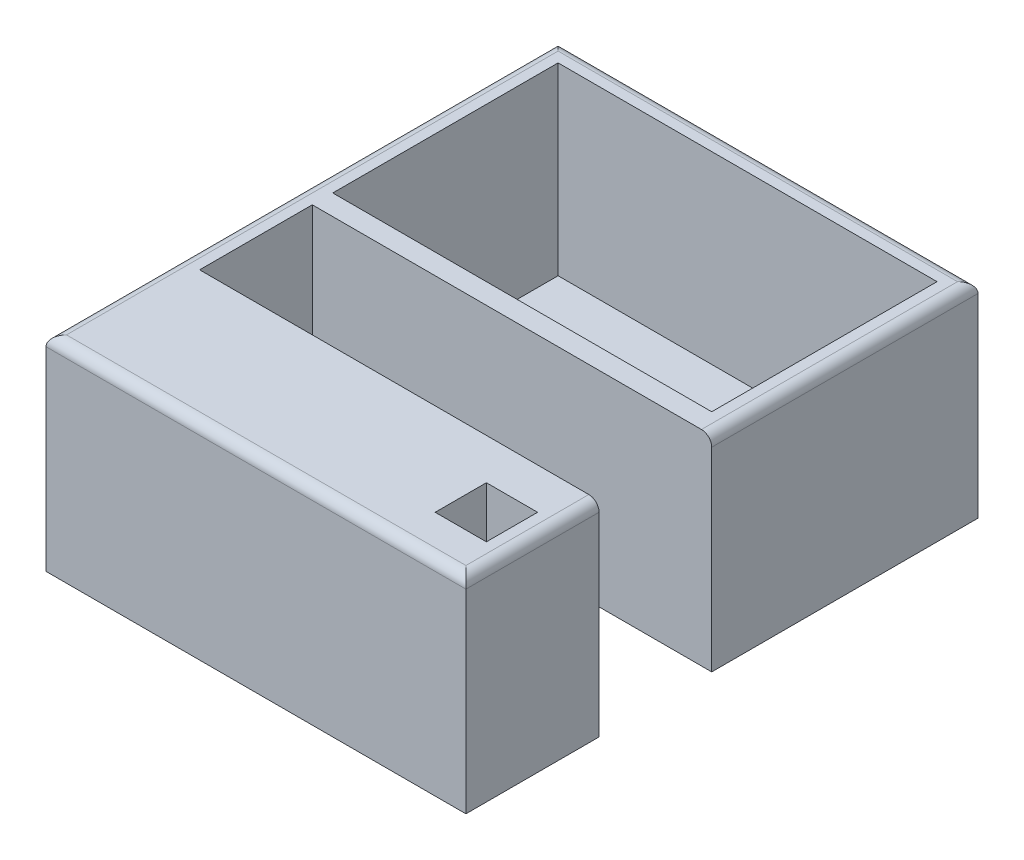
ISO-10303-21;
HEADER;
FILE_DESCRIPTION(('STEP AP214'),'2;1');
FILE_NAME('part.step','',(''),(''),'','','');
FILE_SCHEMA(('AUTOMOTIVE_DESIGN { 1 0 10303 214 1 1 1 1 }'));
ENDSEC;
DATA;
#1=APPLICATION_CONTEXT('core data for automotive mechanical design processes');
#2=APPLICATION_PROTOCOL_DEFINITION('international standard','automotive_design',2000,#1);
#3=PRODUCT_CONTEXT('',#1,'mechanical');
#4=PRODUCT('Part','Part','',(#3));
#5=PRODUCT_RELATED_PRODUCT_CATEGORY('part','',(#4));
#6=PRODUCT_DEFINITION_FORMATION('','',#4);
#7=PRODUCT_DEFINITION_CONTEXT('part definition',#1,'design');
#8=PRODUCT_DEFINITION('design','',#6,#7);
#9=PRODUCT_DEFINITION_SHAPE('','',#8);
#10=(LENGTH_UNIT() NAMED_UNIT(*) SI_UNIT(.MILLI.,.METRE.));
#11=(NAMED_UNIT(*) PLANE_ANGLE_UNIT() SI_UNIT($,.RADIAN.));
#12=(NAMED_UNIT(*) SI_UNIT($,.STERADIAN.) SOLID_ANGLE_UNIT());
#13=UNCERTAINTY_MEASURE_WITH_UNIT(LENGTH_MEASURE(1.E-05),#10,'distance_accuracy_value','');
#14=(GEOMETRIC_REPRESENTATION_CONTEXT(3) GLOBAL_UNCERTAINTY_ASSIGNED_CONTEXT((#13)) GLOBAL_UNIT_ASSIGNED_CONTEXT((#10,
#11,#12)) REPRESENTATION_CONTEXT('',''));
#15=CARTESIAN_POINT('',(0.,0.,0.));
#16=DIRECTION('',(0.,0.,1.));
#17=DIRECTION('',(1.,0.,0.));
#18=AXIS2_PLACEMENT_3D('',#15,#16,#17);
#19=CARTESIAN_POINT('',(0.,2.,0.));
#20=DIRECTION('',(0.,1.,0.));
#21=DIRECTION('',(0.,0.,1.));
#22=AXIS2_PLACEMENT_3D('',#19,#20,#21);
#23=PLANE('',#22);
#24=DIRECTION('',(-1.,0.,0.));
#25=VECTOR('',#24,1.);
#26=CARTESIAN_POINT('',(0.,2.,12.));
#27=LINE('',#26,#25);
#28=CARTESIAN_POINT('',(-17.5,2.,12.));
#29=VERTEX_POINT('',#28);
#30=CARTESIAN_POINT('',(-18.5,2.,12.));
#31=VERTEX_POINT('',#30);
#32=EDGE_CURVE('E319',#29,#31,#27,.T.);
#33=ORIENTED_EDGE('',*,*,#32,.F.);
#34=DIRECTION('',(0.,0.,-1.));
#35=VECTOR('',#34,1.);
#36=CARTESIAN_POINT('',(-17.5,2.,12.));
#37=LINE('',#36,#35);
#38=CARTESIAN_POINT('',(-17.5,2.,1.));
#39=VERTEX_POINT('',#38);
#40=EDGE_CURVE('E298',#29,#39,#37,.T.);
#41=ORIENTED_EDGE('',*,*,#40,.T.);
#42=DIRECTION('',(-1.,0.,0.));
#43=VECTOR('',#42,1.);
#44=CARTESIAN_POINT('',(0.,2.,1.));
#45=LINE('',#44,#43);
#46=CARTESIAN_POINT('',(-18.5,2.,1.));
#47=VERTEX_POINT('',#46);
#48=EDGE_CURVE('E312',#39,#47,#45,.T.);
#49=ORIENTED_EDGE('',*,*,#48,.T.);
#50=DIRECTION('',(0.,0.,1.));
#51=VECTOR('',#50,1.);
#52=CARTESIAN_POINT('',(-18.5,2.,0.));
#53=LINE('',#52,#51);
#54=EDGE_CURVE('E196',#47,#31,#53,.T.);
#55=ORIENTED_EDGE('',*,*,#54,.T.);
#56=EDGE_LOOP('',(#33,#41,#49,#55));
#57=FACE_BOUND('',#56,.T.);
#58=ADVANCED_FACE('F33',(#57),#23,.T.);
#59=CARTESIAN_POINT('',(20.5,2.,12.));
#60=DIRECTION('',(-1.,0.,0.));
#61=DIRECTION('',(0.,0.,1.));
#62=AXIS2_PLACEMENT_3D('',#59,#60,#61);
#63=PLANE('',#62);
#64=DIRECTION('',(0.,-1.,0.));
#65=VECTOR('',#64,1.);
#66=CARTESIAN_POINT('',(20.5,2.,12.));
#67=LINE('',#66,#65);
#68=CARTESIAN_POINT('',(20.5,19.,12.));
#69=VERTEX_POINT('',#68);
#70=CARTESIAN_POINT('',(20.5,0.,12.));
#71=VERTEX_POINT('',#70);
#72=EDGE_CURVE('E310',#69,#71,#67,.T.);
#73=ORIENTED_EDGE('',*,*,#72,.F.);
#74=DIRECTION('',(0.,0.,-1.));
#75=VECTOR('',#74,1.);
#76=CARTESIAN_POINT('',(20.5,19.,25.));
#77=LINE('',#76,#75);
#78=CARTESIAN_POINT('',(20.5,19.,25.));
#79=VERTEX_POINT('',#78);
#80=EDGE_CURVE('E11',#69,#79,#77,.F.);
#81=ORIENTED_EDGE('',*,*,#80,.T.);
#82=DIRECTION('',(0.,-1.,0.));
#83=VECTOR('',#82,1.);
#84=CARTESIAN_POINT('',(20.5,2.,25.));
#85=LINE('',#84,#83);
#86=CARTESIAN_POINT('',(20.5,0.,25.));
#87=VERTEX_POINT('',#86);
#88=EDGE_CURVE('E299',#79,#87,#85,.T.);
#89=ORIENTED_EDGE('',*,*,#88,.T.);
#90=DIRECTION('',(0.,0.,-1.));
#91=VECTOR('',#90,1.);
#92=CARTESIAN_POINT('',(20.5,0.,12.));
#93=LINE('',#92,#91);
#94=EDGE_CURVE('E265',#87,#71,#93,.T.);
#95=ORIENTED_EDGE('',*,*,#94,.T.);
#96=EDGE_LOOP('',(#73,#81,#89,#95));
#97=FACE_BOUND('',#96,.T.);
#98=ADVANCED_FACE('F397',(#97),#63,.F.);
#99=CARTESIAN_POINT('',(20.5,2.,12.));
#100=DIRECTION('',(0.,0.,1.));
#101=DIRECTION('',(1.,0.,0.));
#102=AXIS2_PLACEMENT_3D('',#99,#100,#101);
#103=PLANE('',#102);
#104=DIRECTION('',(-1.,0.,0.));
#105=VECTOR('',#104,1.);
#106=CARTESIAN_POINT('',(0.,20.,12.));
#107=LINE('',#106,#105);
#108=CARTESIAN_POINT('',(19.5,20.,12.));
#109=VERTEX_POINT('',#108);
#110=CARTESIAN_POINT('',(-18.5,20.,12.));
#111=VERTEX_POINT('',#110);
#112=EDGE_CURVE('E188',#109,#111,#107,.T.);
#113=ORIENTED_EDGE('',*,*,#112,.F.);
#114=CARTESIAN_POINT('',(19.5,19.,12.));
#115=DIRECTION('',(0.,0.,1.));
#116=DIRECTION('',(1.,0.,0.));
#117=AXIS2_PLACEMENT_3D('',#114,#115,#116);
#118=CIRCLE('',#117,1.);
#119=EDGE_CURVE('E42',#109,#69,#118,.F.);
#120=ORIENTED_EDGE('',*,*,#119,.T.);
#121=ORIENTED_EDGE('',*,*,#72,.T.);
#122=DIRECTION('',(-1.,0.,0.));
#123=VECTOR('',#122,1.);
#124=CARTESIAN_POINT('',(20.5,0.,12.));
#125=LINE('',#124,#123);
#126=CARTESIAN_POINT('',(-17.5,0.,12.));
#127=VERTEX_POINT('',#126);
#128=EDGE_CURVE('E279',#71,#127,#125,.T.);
#129=ORIENTED_EDGE('',*,*,#128,.T.);
#130=DIRECTION('',(0.,-1.,0.));
#131=VECTOR('',#130,1.);
#132=CARTESIAN_POINT('',(-17.5,2.,12.));
#133=LINE('',#132,#131);
#134=EDGE_CURVE('E313',#29,#127,#133,.T.);
#135=ORIENTED_EDGE('',*,*,#134,.F.);
#136=ORIENTED_EDGE('',*,*,#32,.T.);
#137=DIRECTION('',(0.,-1.,0.));
#138=VECTOR('',#137,1.);
#139=CARTESIAN_POINT('',(-18.5,20.,12.));
#140=LINE('',#139,#138);
#141=EDGE_CURVE('E198',#111,#31,#140,.T.);
#142=ORIENTED_EDGE('',*,*,#141,.F.);
#143=EDGE_LOOP('',(#113,#120,#121,#129,#135,#136,#142));
#144=FACE_BOUND('',#143,.T.);
#145=ADVANCED_FACE('F403',(#144),#103,.F.);
#146=CARTESIAN_POINT('',(-17.5,2.,12.));
#147=DIRECTION('',(-1.,0.,0.));
#148=DIRECTION('',(0.,0.,1.));
#149=AXIS2_PLACEMENT_3D('',#146,#147,#148);
#150=PLANE('',#149);
#151=DIRECTION('',(0.,0.,-1.));
#152=VECTOR('',#151,1.);
#153=CARTESIAN_POINT('',(-17.5,0.,12.));
#154=LINE('',#153,#152);
#155=CARTESIAN_POINT('',(-17.5,0.,1.));
#156=VERTEX_POINT('',#155);
#157=EDGE_CURVE('E281',#127,#156,#154,.T.);
#158=ORIENTED_EDGE('',*,*,#157,.T.);
#159=DIRECTION('',(0.,-1.,0.));
#160=VECTOR('',#159,1.);
#161=CARTESIAN_POINT('',(-17.5,2.,1.));
#162=LINE('',#161,#160);
#163=EDGE_CURVE('E309',#39,#156,#162,.T.);
#164=ORIENTED_EDGE('',*,*,#163,.F.);
#165=ORIENTED_EDGE('',*,*,#40,.F.);
#166=ORIENTED_EDGE('',*,*,#134,.T.);
#167=EDGE_LOOP('',(#158,#164,#165,#166));
#168=FACE_BOUND('',#167,.T.);
#169=ADVANCED_FACE('F510',(#168),#150,.F.);
#170=CARTESIAN_POINT('',(20.5,2.,0.999999999999999));
#171=DIRECTION('',(0.,0.,-1.));
#172=DIRECTION('',(-1.,0.,0.));
#173=AXIS2_PLACEMENT_3D('',#170,#171,#172);
#174=PLANE('',#173);
#175=DIRECTION('',(0.,-1.,0.));
#176=VECTOR('',#175,1.);
#177=CARTESIAN_POINT('',(20.5,2.,0.999999999999999));
#178=LINE('',#177,#176);
#179=CARTESIAN_POINT('',(20.5,19.,0.999999999999999));
#180=VERTEX_POINT('',#179);
#181=CARTESIAN_POINT('',(20.5,0.,0.999999999999999));
#182=VERTEX_POINT('',#181);
#183=EDGE_CURVE('E307',#180,#182,#178,.T.);
#184=ORIENTED_EDGE('',*,*,#183,.F.);
#185=CARTESIAN_POINT('',(19.5,19.,0.999999999999999));
#186=DIRECTION('',(0.,0.,-1.));
#187=DIRECTION('',(-1.,0.,0.));
#188=AXIS2_PLACEMENT_3D('',#185,#186,#187);
#189=CIRCLE('',#188,1.);
#190=CARTESIAN_POINT('',(19.5,20.,1.));
#191=VERTEX_POINT('',#190);
#192=EDGE_CURVE('E183',#180,#191,#189,.F.);
#193=ORIENTED_EDGE('',*,*,#192,.T.);
#194=DIRECTION('',(-1.,0.,0.));
#195=VECTOR('',#194,1.);
#196=CARTESIAN_POINT('',(0.,20.,1.));
#197=LINE('',#196,#195);
#198=CARTESIAN_POINT('',(-18.5,20.,1.));
#199=VERTEX_POINT('',#198);
#200=EDGE_CURVE('E176',#191,#199,#197,.T.);
#201=ORIENTED_EDGE('',*,*,#200,.T.);
#202=DIRECTION('',(0.,-1.,0.));
#203=VECTOR('',#202,1.);
#204=CARTESIAN_POINT('',(-18.5,20.,1.));
#205=LINE('',#204,#203);
#206=EDGE_CURVE('E180',#199,#47,#205,.T.);
#207=ORIENTED_EDGE('',*,*,#206,.T.);
#208=ORIENTED_EDGE('',*,*,#48,.F.);
#209=ORIENTED_EDGE('',*,*,#163,.T.);
#210=DIRECTION('',(1.,0.,0.));
#211=VECTOR('',#210,1.);
#212=CARTESIAN_POINT('',(20.5,0.,0.999999999999999));
#213=LINE('',#212,#211);
#214=EDGE_CURVE('E283',#156,#182,#213,.T.);
#215=ORIENTED_EDGE('',*,*,#214,.T.);
#216=EDGE_LOOP('',(#184,#193,#201,#207,#208,#209,#215));
#217=FACE_BOUND('',#216,.T.);
#218=ADVANCED_FACE('F179',(#217),#174,.F.);
#219=CARTESIAN_POINT('',(20.5,2.,-25.));
#220=DIRECTION('',(-1.,0.,0.));
#221=DIRECTION('',(0.,0.,1.));
#222=AXIS2_PLACEMENT_3D('',#219,#220,#221);
#223=PLANE('',#222);
#224=DIRECTION('',(0.,-1.,0.));
#225=VECTOR('',#224,1.);
#226=CARTESIAN_POINT('',(20.5,2.,-25.));
#227=LINE('',#226,#225);
#228=CARTESIAN_POINT('',(20.5,19.,-25.));
#229=VERTEX_POINT('',#228);
#230=CARTESIAN_POINT('',(20.5,0.,-25.));
#231=VERTEX_POINT('',#230);
#232=EDGE_CURVE('E305',#229,#231,#227,.T.);
#233=ORIENTED_EDGE('',*,*,#232,.F.);
#234=DIRECTION('',(0.,0.,-1.));
#235=VECTOR('',#234,1.);
#236=CARTESIAN_POINT('',(20.5,19.,0.999999999999997));
#237=LINE('',#236,#235);
#238=EDGE_CURVE('E338',#229,#180,#237,.F.);
#239=ORIENTED_EDGE('',*,*,#238,.T.);
#240=ORIENTED_EDGE('',*,*,#183,.T.);
#241=DIRECTION('',(0.,0.,-1.));
#242=VECTOR('',#241,1.);
#243=CARTESIAN_POINT('',(20.5,0.,-25.));
#244=LINE('',#243,#242);
#245=EDGE_CURVE('E286',#182,#231,#244,.T.);
#246=ORIENTED_EDGE('',*,*,#245,.T.);
#247=EDGE_LOOP('',(#233,#239,#240,#246));
#248=FACE_BOUND('',#247,.T.);
#249=ADVANCED_FACE('F518',(#248),#223,.F.);
#250=CARTESIAN_POINT('',(-20.5,2.,-25.));
#251=DIRECTION('',(0.,0.,1.));
#252=DIRECTION('',(1.,0.,0.));
#253=AXIS2_PLACEMENT_3D('',#250,#251,#252);
#254=PLANE('',#253);
#255=DIRECTION('',(0.,-1.,0.));
#256=VECTOR('',#255,1.);
#257=CARTESIAN_POINT('',(-20.5,2.,-25.));
#258=LINE('',#257,#256);
#259=CARTESIAN_POINT('',(-20.5,19.,-25.));
#260=VERTEX_POINT('',#259);
#261=CARTESIAN_POINT('',(-20.5,0.,-25.));
#262=VERTEX_POINT('',#261);
#263=EDGE_CURVE('E303',#260,#262,#258,.T.);
#264=ORIENTED_EDGE('',*,*,#263,.F.);
#265=DIRECTION('',(-1.,0.,0.));
#266=VECTOR('',#265,1.);
#267=CARTESIAN_POINT('',(20.5,19.,-25.));
#268=LINE('',#267,#266);
#269=EDGE_CURVE('E341',#260,#229,#268,.F.);
#270=ORIENTED_EDGE('',*,*,#269,.T.);
#271=ORIENTED_EDGE('',*,*,#232,.T.);
#272=DIRECTION('',(-1.,0.,0.));
#273=VECTOR('',#272,1.);
#274=CARTESIAN_POINT('',(-20.5,0.,-25.));
#275=LINE('',#274,#273);
#276=EDGE_CURVE('E289',#231,#262,#275,.T.);
#277=ORIENTED_EDGE('',*,*,#276,.T.);
#278=EDGE_LOOP('',(#264,#270,#271,#277));
#279=FACE_BOUND('',#278,.T.);
#280=ADVANCED_FACE('F525',(#279),#254,.F.);
#281=CARTESIAN_POINT('',(-20.5,2.,-25.));
#282=DIRECTION('',(1.,0.,0.));
#283=DIRECTION('',(0.,0.,-1.));
#284=AXIS2_PLACEMENT_3D('',#281,#282,#283);
#285=PLANE('',#284);
#286=DIRECTION('',(0.,-1.,0.));
#287=VECTOR('',#286,1.);
#288=CARTESIAN_POINT('',(-20.5,2.,25.));
#289=LINE('',#288,#287);
#290=CARTESIAN_POINT('',(-20.5,19.,25.));
#291=VERTEX_POINT('',#290);
#292=CARTESIAN_POINT('',(-20.5,0.,25.));
#293=VERTEX_POINT('',#292);
#294=EDGE_CURVE('E301',#291,#293,#289,.T.);
#295=ORIENTED_EDGE('',*,*,#294,.F.);
#296=DIRECTION('',(0.,0.,1.));
#297=VECTOR('',#296,1.);
#298=CARTESIAN_POINT('',(-20.5,19.,-25.));
#299=LINE('',#298,#297);
#300=EDGE_CURVE('E343',#291,#260,#299,.F.);
#301=ORIENTED_EDGE('',*,*,#300,.T.);
#302=ORIENTED_EDGE('',*,*,#263,.T.);
#303=DIRECTION('',(0.,0.,1.));
#304=VECTOR('',#303,1.);
#305=CARTESIAN_POINT('',(-20.5,0.,-25.));
#306=LINE('',#305,#304);
#307=EDGE_CURVE('E292',#262,#293,#306,.T.);
#308=ORIENTED_EDGE('',*,*,#307,.T.);
#309=EDGE_LOOP('',(#295,#301,#302,#308));
#310=FACE_BOUND('',#309,.T.);
#311=ADVANCED_FACE('F533',(#310),#285,.F.);
#312=CARTESIAN_POINT('',(-20.5,2.,25.));
#313=DIRECTION('',(0.,0.,-1.));
#314=DIRECTION('',(-1.,0.,0.));
#315=AXIS2_PLACEMENT_3D('',#312,#313,#314);
#316=PLANE('',#315);
#317=ORIENTED_EDGE('',*,*,#88,.F.);
#318=DIRECTION('',(1.,0.,0.));
#319=VECTOR('',#318,1.);
#320=CARTESIAN_POINT('',(-20.5,19.,25.));
#321=LINE('',#320,#319);
#322=EDGE_CURVE('E345',#79,#291,#321,.F.);
#323=ORIENTED_EDGE('',*,*,#322,.T.);
#324=ORIENTED_EDGE('',*,*,#294,.T.);
#325=DIRECTION('',(1.,0.,0.));
#326=VECTOR('',#325,1.);
#327=CARTESIAN_POINT('',(-20.5,0.,25.));
#328=LINE('',#327,#326);
#329=EDGE_CURVE('E295',#293,#87,#328,.T.);
#330=ORIENTED_EDGE('',*,*,#329,.T.);
#331=EDGE_LOOP('',(#317,#323,#324,#330));
#332=FACE_BOUND('',#331,.T.);
#333=ADVANCED_FACE('F540',(#332),#316,.F.);
#334=CARTESIAN_POINT('',(0.,0.,0.));
#335=DIRECTION('',(0.,1.,0.));
#336=DIRECTION('',(0.,0.,1.));
#337=AXIS2_PLACEMENT_3D('',#334,#335,#336);
#338=PLANE('',#337);
#339=CARTESIAN_POINT('',(16.,0.,18.5));
#340=DIRECTION('',(0.,1.,0.));
#341=DIRECTION('',(0.,0.,1.));
#342=AXIS2_PLACEMENT_3D('',#339,#340,#341);
#343=CIRCLE('',#342,1.25);
#344=CARTESIAN_POINT('',(16.,0.,19.75));
#345=VERTEX_POINT('',#344);
#346=EDGE_CURVE('E365',#345,#345,#343,.T.);
#347=ORIENTED_EDGE('',*,*,#346,.T.);
#348=EDGE_LOOP('',(#347));
#349=FACE_BOUND('',#348,.T.);
#350=CARTESIAN_POINT('',(16.,0.,-20.5));
#351=DIRECTION('',(0.,1.,0.));
#352=DIRECTION('',(0.,0.,1.));
#353=AXIS2_PLACEMENT_3D('',#350,#351,#352);
#354=CIRCLE('',#353,1.25);
#355=CARTESIAN_POINT('',(16.,0.,-19.25));
#356=VERTEX_POINT('',#355);
#357=EDGE_CURVE('E208',#356,#356,#354,.T.);
#358=ORIENTED_EDGE('',*,*,#357,.T.);
#359=EDGE_LOOP('',(#358));
#360=FACE_BOUND('',#359,.T.);
#361=ORIENTED_EDGE('',*,*,#94,.F.);
#362=ORIENTED_EDGE('',*,*,#329,.F.);
#363=ORIENTED_EDGE('',*,*,#307,.F.);
#364=ORIENTED_EDGE('',*,*,#276,.F.);
#365=ORIENTED_EDGE('',*,*,#245,.F.);
#366=ORIENTED_EDGE('',*,*,#214,.F.);
#367=ORIENTED_EDGE('',*,*,#157,.F.);
#368=ORIENTED_EDGE('',*,*,#128,.F.);
#369=EDGE_LOOP('',(#361,#362,#363,#364,#365,#366,#367,#368));
#370=FACE_BOUND('',#369,.T.);
#371=ADVANCED_FACE('F378',(#349,#360,#370),#338,.F.);
#372=CARTESIAN_POINT('',(0.,20.,16.));
#373=DIRECTION('',(0.,0.,-1.));
#374=DIRECTION('',(-1.,0.,0.));
#375=AXIS2_PLACEMENT_3D('',#372,#373,#374);
#376=PLANE('',#375);
#377=DIRECTION('',(1.,0.,0.));
#378=VECTOR('',#377,1.);
#379=CARTESIAN_POINT('',(0.,2.,16.));
#380=LINE('',#379,#378);
#381=CARTESIAN_POINT('',(13.5,2.,16.));
#382=VERTEX_POINT('',#381);
#383=CARTESIAN_POINT('',(18.5,2.,16.));
#384=VERTEX_POINT('',#383);
#385=EDGE_CURVE('E245',#382,#384,#380,.T.);
#386=ORIENTED_EDGE('',*,*,#385,.T.);
#387=DIRECTION('',(0.,-1.,0.));
#388=VECTOR('',#387,1.);
#389=CARTESIAN_POINT('',(18.5,20.,16.));
#390=LINE('',#389,#388);
#391=CARTESIAN_POINT('',(18.5,20.,16.));
#392=VERTEX_POINT('',#391);
#393=EDGE_CURVE('E262',#392,#384,#390,.T.);
#394=ORIENTED_EDGE('',*,*,#393,.F.);
#395=DIRECTION('',(1.,0.,0.));
#396=VECTOR('',#395,1.);
#397=CARTESIAN_POINT('',(0.,20.,16.));
#398=LINE('',#397,#396);
#399=CARTESIAN_POINT('',(13.5,20.,16.));
#400=VERTEX_POINT('',#399);
#401=EDGE_CURVE('E223',#400,#392,#398,.T.);
#402=ORIENTED_EDGE('',*,*,#401,.F.);
#403=DIRECTION('',(0.,-1.,0.));
#404=VECTOR('',#403,1.);
#405=CARTESIAN_POINT('',(13.5,20.,16.));
#406=LINE('',#405,#404);
#407=EDGE_CURVE('E252',#400,#382,#406,.T.);
#408=ORIENTED_EDGE('',*,*,#407,.T.);
#409=EDGE_LOOP('',(#386,#394,#402,#408));
#410=FACE_BOUND('',#409,.T.);
#411=ADVANCED_FACE('F419',(#410),#376,.F.);
#412=CARTESIAN_POINT('',(18.5,20.,0.));
#413=DIRECTION('',(1.,0.,0.));
#414=DIRECTION('',(0.,0.,-1.));
#415=AXIS2_PLACEMENT_3D('',#412,#413,#414);
#416=PLANE('',#415);
#417=DIRECTION('',(0.,0.,1.));
#418=VECTOR('',#417,1.);
#419=CARTESIAN_POINT('',(18.5,2.,0.));
#420=LINE('',#419,#418);
#421=CARTESIAN_POINT('',(18.5,2.,21.));
#422=VERTEX_POINT('',#421);
#423=EDGE_CURVE('E248',#384,#422,#420,.T.);
#424=ORIENTED_EDGE('',*,*,#423,.T.);
#425=DIRECTION('',(0.,-1.,0.));
#426=VECTOR('',#425,1.);
#427=CARTESIAN_POINT('',(18.5,20.,21.));
#428=LINE('',#427,#426);
#429=CARTESIAN_POINT('',(18.5,20.,21.));
#430=VERTEX_POINT('',#429);
#431=EDGE_CURVE('E259',#430,#422,#428,.T.);
#432=ORIENTED_EDGE('',*,*,#431,.F.);
#433=DIRECTION('',(0.,0.,1.));
#434=VECTOR('',#433,1.);
#435=CARTESIAN_POINT('',(18.5,20.,0.));
#436=LINE('',#435,#434);
#437=EDGE_CURVE('E226',#392,#430,#436,.T.);
#438=ORIENTED_EDGE('',*,*,#437,.F.);
#439=ORIENTED_EDGE('',*,*,#393,.T.);
#440=EDGE_LOOP('',(#424,#432,#438,#439));
#441=FACE_BOUND('',#440,.T.);
#442=ADVANCED_FACE('F428',(#441),#416,.F.);
#443=CARTESIAN_POINT('',(0.,20.,21.));
#444=DIRECTION('',(0.,0.,-1.));
#445=DIRECTION('',(-1.,0.,0.));
#446=AXIS2_PLACEMENT_3D('',#443,#444,#445);
#447=PLANE('',#446);
#448=DIRECTION('',(1.,0.,0.));
#449=VECTOR('',#448,1.);
#450=CARTESIAN_POINT('',(0.,2.,21.));
#451=LINE('',#450,#449);
#452=CARTESIAN_POINT('',(13.5,2.,21.));
#453=VERTEX_POINT('',#452);
#454=EDGE_CURVE('E205',#453,#422,#451,.T.);
#455=ORIENTED_EDGE('',*,*,#454,.F.);
#456=DIRECTION('',(0.,-1.,0.));
#457=VECTOR('',#456,1.);
#458=CARTESIAN_POINT('',(13.5,20.,21.));
#459=LINE('',#458,#457);
#460=CARTESIAN_POINT('',(13.5,20.,21.));
#461=VERTEX_POINT('',#460);
#462=EDGE_CURVE('E255',#461,#453,#459,.T.);
#463=ORIENTED_EDGE('',*,*,#462,.F.);
#464=DIRECTION('',(1.,0.,0.));
#465=VECTOR('',#464,1.);
#466=CARTESIAN_POINT('',(0.,20.,21.));
#467=LINE('',#466,#465);
#468=EDGE_CURVE('E228',#461,#430,#467,.T.);
#469=ORIENTED_EDGE('',*,*,#468,.T.);
#470=ORIENTED_EDGE('',*,*,#431,.T.);
#471=EDGE_LOOP('',(#455,#463,#469,#470));
#472=FACE_BOUND('',#471,.T.);
#473=ADVANCED_FACE('F425',(#472),#447,.T.);
#474=CARTESIAN_POINT('',(0.,20.,-23.));
#475=DIRECTION('',(0.,0.,-1.));
#476=DIRECTION('',(-1.,0.,0.));
#477=AXIS2_PLACEMENT_3D('',#474,#475,#476);
#478=PLANE('',#477);
#479=DIRECTION('',(1.,0.,0.));
#480=VECTOR('',#479,1.);
#481=CARTESIAN_POINT('',(0.,2.,-23.));
#482=LINE('',#481,#480);
#483=CARTESIAN_POINT('',(-18.5,2.,-23.));
#484=VERTEX_POINT('',#483);
#485=CARTESIAN_POINT('',(18.5,2.,-23.));
#486=VERTEX_POINT('',#485);
#487=EDGE_CURVE('E235',#484,#486,#482,.T.);
#488=ORIENTED_EDGE('',*,*,#487,.T.);
#489=DIRECTION('',(0.,-1.,0.));
#490=VECTOR('',#489,1.);
#491=CARTESIAN_POINT('',(18.5,20.,-23.));
#492=LINE('',#491,#490);
#493=CARTESIAN_POINT('',(18.5,20.,-23.));
#494=VERTEX_POINT('',#493);
#495=EDGE_CURVE('E256',#494,#486,#492,.T.);
#496=ORIENTED_EDGE('',*,*,#495,.F.);
#497=DIRECTION('',(1.,0.,0.));
#498=VECTOR('',#497,1.);
#499=CARTESIAN_POINT('',(0.,20.,-23.));
#500=LINE('',#499,#498);
#501=CARTESIAN_POINT('',(-18.5,20.,-23.));
#502=VERTEX_POINT('',#501);
#503=EDGE_CURVE('E212',#502,#494,#500,.T.);
#504=ORIENTED_EDGE('',*,*,#503,.F.);
#505=DIRECTION('',(0.,-1.,0.));
#506=VECTOR('',#505,1.);
#507=CARTESIAN_POINT('',(-18.5,20.,-23.));
#508=LINE('',#507,#506);
#509=EDGE_CURVE('E197',#502,#484,#508,.T.);
#510=ORIENTED_EDGE('',*,*,#509,.T.);
#511=EDGE_LOOP('',(#488,#496,#504,#510));
#512=FACE_BOUND('',#511,.T.);
#513=ADVANCED_FACE('F436',(#512),#478,.F.);
#514=CARTESIAN_POINT('',(18.5,20.,0.));
#515=DIRECTION('',(1.,0.,0.));
#516=DIRECTION('',(0.,0.,-1.));
#517=AXIS2_PLACEMENT_3D('',#514,#515,#516);
#518=PLANE('',#517);
#519=DIRECTION('',(0.,0.,1.));
#520=VECTOR('',#519,1.);
#521=CARTESIAN_POINT('',(18.5,2.,0.));
#522=LINE('',#521,#520);
#523=CARTESIAN_POINT('',(18.5,2.,-0.999999999999996));
#524=VERTEX_POINT('',#523);
#525=EDGE_CURVE('E238',#486,#524,#522,.T.);
#526=ORIENTED_EDGE('',*,*,#525,.T.);
#527=DIRECTION('',(0.,-1.,0.));
#528=VECTOR('',#527,1.);
#529=CARTESIAN_POINT('',(18.5,20.,-0.999999999999996));
#530=LINE('',#529,#528);
#531=CARTESIAN_POINT('',(18.5,20.,-0.999999999999996));
#532=VERTEX_POINT('',#531);
#533=EDGE_CURVE('E271',#532,#524,#530,.T.);
#534=ORIENTED_EDGE('',*,*,#533,.F.);
#535=DIRECTION('',(0.,0.,1.));
#536=VECTOR('',#535,1.);
#537=CARTESIAN_POINT('',(18.5,20.,0.));
#538=LINE('',#537,#536);
#539=EDGE_CURVE('E215',#494,#532,#538,.T.);
#540=ORIENTED_EDGE('',*,*,#539,.F.);
#541=ORIENTED_EDGE('',*,*,#495,.T.);
#542=EDGE_LOOP('',(#526,#534,#540,#541));
#543=FACE_BOUND('',#542,.T.);
#544=ADVANCED_FACE('F448',(#543),#518,.F.);
#545=CARTESIAN_POINT('',(0.,20.,-0.999999999999996));
#546=DIRECTION('',(0.,0.,-1.));
#547=DIRECTION('',(-1.,0.,0.));
#548=AXIS2_PLACEMENT_3D('',#545,#546,#547);
#549=PLANE('',#548);
#550=DIRECTION('',(1.,0.,0.));
#551=VECTOR('',#550,1.);
#552=CARTESIAN_POINT('',(0.,2.,-0.999999999999996));
#553=LINE('',#552,#551);
#554=CARTESIAN_POINT('',(-18.5,2.,-0.999999999999996));
#555=VERTEX_POINT('',#554);
#556=EDGE_CURVE('E241',#555,#524,#553,.T.);
#557=ORIENTED_EDGE('',*,*,#556,.F.);
#558=DIRECTION('',(0.,-1.,0.));
#559=VECTOR('',#558,1.);
#560=CARTESIAN_POINT('',(-18.5,20.,-0.999999999999996));
#561=LINE('',#560,#559);
#562=CARTESIAN_POINT('',(-18.5,20.,-0.999999999999996));
#563=VERTEX_POINT('',#562);
#564=EDGE_CURVE('E268',#563,#555,#561,.T.);
#565=ORIENTED_EDGE('',*,*,#564,.F.);
#566=DIRECTION('',(1.,0.,0.));
#567=VECTOR('',#566,1.);
#568=CARTESIAN_POINT('',(0.,20.,-0.999999999999996));
#569=LINE('',#568,#567);
#570=EDGE_CURVE('E217',#563,#532,#569,.T.);
#571=ORIENTED_EDGE('',*,*,#570,.T.);
#572=ORIENTED_EDGE('',*,*,#533,.T.);
#573=EDGE_LOOP('',(#557,#565,#571,#572));
#574=FACE_BOUND('',#573,.T.);
#575=ADVANCED_FACE('F445',(#574),#549,.T.);
#576=CARTESIAN_POINT('',(-18.5,20.,0.));
#577=DIRECTION('',(1.,0.,0.));
#578=DIRECTION('',(0.,0.,-1.));
#579=AXIS2_PLACEMENT_3D('',#576,#577,#578);
#580=PLANE('',#579);
#581=ORIENTED_EDGE('',*,*,#54,.F.);
#582=ORIENTED_EDGE('',*,*,#206,.F.);
#583=DIRECTION('',(0.,0.,1.));
#584=VECTOR('',#583,1.);
#585=CARTESIAN_POINT('',(-18.5,20.,0.));
#586=LINE('',#585,#584);
#587=EDGE_CURVE('E189',#199,#111,#586,.T.);
#588=ORIENTED_EDGE('',*,*,#587,.T.);
#589=ORIENTED_EDGE('',*,*,#141,.T.);
#590=EDGE_LOOP('',(#581,#582,#588,#589));
#591=FACE_BOUND('',#590,.T.);
#592=ADVANCED_FACE('F193',(#591),#580,.T.);
#593=CARTESIAN_POINT('',(-18.5,20.,0.));
#594=DIRECTION('',(1.,0.,0.));
#595=DIRECTION('',(0.,0.,-1.));
#596=AXIS2_PLACEMENT_3D('',#593,#594,#595);
#597=PLANE('',#596);
#598=DIRECTION('',(0.,0.,1.));
#599=VECTOR('',#598,1.);
#600=CARTESIAN_POINT('',(-18.5,2.,0.));
#601=LINE('',#600,#599);
#602=EDGE_CURVE('E243',#484,#555,#601,.T.);
#603=ORIENTED_EDGE('',*,*,#602,.F.);
#604=ORIENTED_EDGE('',*,*,#509,.F.);
#605=DIRECTION('',(0.,0.,1.));
#606=VECTOR('',#605,1.);
#607=CARTESIAN_POINT('',(-18.5,20.,0.));
#608=LINE('',#607,#606);
#609=EDGE_CURVE('E220',#502,#563,#608,.T.);
#610=ORIENTED_EDGE('',*,*,#609,.T.);
#611=ORIENTED_EDGE('',*,*,#564,.T.);
#612=EDGE_LOOP('',(#603,#604,#610,#611));
#613=FACE_BOUND('',#612,.T.);
#614=ADVANCED_FACE('F441',(#613),#597,.T.);
#615=CARTESIAN_POINT('',(13.5,20.,0.));
#616=DIRECTION('',(1.,0.,0.));
#617=DIRECTION('',(0.,0.,-1.));
#618=AXIS2_PLACEMENT_3D('',#615,#616,#617);
#619=PLANE('',#618);
#620=DIRECTION('',(0.,0.,1.));
#621=VECTOR('',#620,1.);
#622=CARTESIAN_POINT('',(13.5,2.,0.));
#623=LINE('',#622,#621);
#624=EDGE_CURVE('E203',#382,#453,#623,.T.);
#625=ORIENTED_EDGE('',*,*,#624,.F.);
#626=ORIENTED_EDGE('',*,*,#407,.F.);
#627=DIRECTION('',(0.,0.,1.));
#628=VECTOR('',#627,1.);
#629=CARTESIAN_POINT('',(13.5,20.,0.));
#630=LINE('',#629,#628);
#631=EDGE_CURVE('E231',#400,#461,#630,.T.);
#632=ORIENTED_EDGE('',*,*,#631,.T.);
#633=ORIENTED_EDGE('',*,*,#462,.T.);
#634=EDGE_LOOP('',(#625,#626,#632,#633));
#635=FACE_BOUND('',#634,.T.);
#636=ADVANCED_FACE('F413',(#635),#619,.T.);
#637=CARTESIAN_POINT('',(0.,20.,0.));
#638=DIRECTION('',(0.,1.,0.));
#639=DIRECTION('',(0.,0.,1.));
#640=AXIS2_PLACEMENT_3D('',#637,#638,#639);
#641=PLANE('',#640);
#642=ORIENTED_EDGE('',*,*,#200,.F.);
#643=DIRECTION('',(0.,0.,-1.));
#644=VECTOR('',#643,1.);
#645=CARTESIAN_POINT('',(19.5,20.,-25.));
#646=LINE('',#645,#644);
#647=CARTESIAN_POINT('',(19.5,20.,-24.));
#648=VERTEX_POINT('',#647);
#649=EDGE_CURVE('E336',#191,#648,#646,.T.);
#650=ORIENTED_EDGE('',*,*,#649,.T.);
#651=DIRECTION('',(-1.,0.,0.));
#652=VECTOR('',#651,1.);
#653=CARTESIAN_POINT('',(-20.5,20.,-24.));
#654=LINE('',#653,#652);
#655=CARTESIAN_POINT('',(-19.5,20.,-24.));
#656=VERTEX_POINT('',#655);
#657=EDGE_CURVE('E334',#648,#656,#654,.T.);
#658=ORIENTED_EDGE('',*,*,#657,.T.);
#659=DIRECTION('',(0.,0.,1.));
#660=VECTOR('',#659,1.);
#661=CARTESIAN_POINT('',(-19.5,20.,25.));
#662=LINE('',#661,#660);
#663=CARTESIAN_POINT('',(-19.5,20.,24.));
#664=VERTEX_POINT('',#663);
#665=EDGE_CURVE('E332',#656,#664,#662,.T.);
#666=ORIENTED_EDGE('',*,*,#665,.T.);
#667=DIRECTION('',(1.,0.,0.));
#668=VECTOR('',#667,1.);
#669=CARTESIAN_POINT('',(20.5,20.,24.));
#670=LINE('',#669,#668);
#671=CARTESIAN_POINT('',(19.5,20.,24.));
#672=VERTEX_POINT('',#671);
#673=EDGE_CURVE('E330',#664,#672,#670,.T.);
#674=ORIENTED_EDGE('',*,*,#673,.T.);
#675=DIRECTION('',(0.,0.,-1.));
#676=VECTOR('',#675,1.);
#677=CARTESIAN_POINT('',(19.5,20.,12.));
#678=LINE('',#677,#676);
#679=EDGE_CURVE('E322',#672,#109,#678,.T.);
#680=ORIENTED_EDGE('',*,*,#679,.T.);
#681=ORIENTED_EDGE('',*,*,#112,.T.);
#682=ORIENTED_EDGE('',*,*,#587,.F.);
#683=EDGE_LOOP('',(#642,#650,#658,#666,#674,#680,#681,#682));
#684=FACE_BOUND('',#683,.T.);
#685=ORIENTED_EDGE('',*,*,#503,.T.);
#686=ORIENTED_EDGE('',*,*,#539,.T.);
#687=ORIENTED_EDGE('',*,*,#570,.F.);
#688=ORIENTED_EDGE('',*,*,#609,.F.);
#689=EDGE_LOOP('',(#685,#686,#687,#688));
#690=FACE_BOUND('',#689,.T.);
#691=ORIENTED_EDGE('',*,*,#401,.T.);
#692=ORIENTED_EDGE('',*,*,#437,.T.);
#693=ORIENTED_EDGE('',*,*,#468,.F.);
#694=ORIENTED_EDGE('',*,*,#631,.F.);
#695=EDGE_LOOP('',(#691,#692,#693,#694));
#696=FACE_BOUND('',#695,.T.);
#697=ADVANCED_FACE('F200',(#684,#690,#696),#641,.T.);
#698=CARTESIAN_POINT('',(16.,2.,18.5));
#699=DIRECTION('',(0.,1.,0.));
#700=DIRECTION('',(0.,0.,1.));
#701=AXIS2_PLACEMENT_3D('',#698,#699,#700);
#702=CIRCLE('',#701,1.25);
#703=CARTESIAN_POINT('',(16.,2.,19.75));
#704=VERTEX_POINT('',#703);
#705=EDGE_CURVE('E359',#704,#704,#702,.T.);
#706=ORIENTED_EDGE('',*,*,#705,.F.);
#707=EDGE_LOOP('',(#706));
#708=FACE_BOUND('',#707,.T.);
#709=ORIENTED_EDGE('',*,*,#385,.F.);
#710=ORIENTED_EDGE('',*,*,#624,.T.);
#711=ORIENTED_EDGE('',*,*,#454,.T.);
#712=ORIENTED_EDGE('',*,*,#423,.F.);
#713=EDGE_LOOP('',(#709,#710,#711,#712));
#714=FACE_BOUND('',#713,.T.);
#715=ADVANCED_FACE('F392',(#708,#714),#23,.T.);
#716=CARTESIAN_POINT('',(16.,2.,-20.5));
#717=DIRECTION('',(0.,1.,0.));
#718=DIRECTION('',(0.,0.,1.));
#719=AXIS2_PLACEMENT_3D('',#716,#717,#718);
#720=CIRCLE('',#719,1.25);
#721=CARTESIAN_POINT('',(16.,2.,-19.25));
#722=VERTEX_POINT('',#721);
#723=EDGE_CURVE('E370',#722,#722,#720,.T.);
#724=ORIENTED_EDGE('',*,*,#723,.F.);
#725=EDGE_LOOP('',(#724));
#726=FACE_BOUND('',#725,.T.);
#727=ORIENTED_EDGE('',*,*,#487,.F.);
#728=ORIENTED_EDGE('',*,*,#602,.T.);
#729=ORIENTED_EDGE('',*,*,#556,.T.);
#730=ORIENTED_EDGE('',*,*,#525,.F.);
#731=EDGE_LOOP('',(#727,#728,#729,#730));
#732=FACE_BOUND('',#731,.T.);
#733=ADVANCED_FACE('F384',(#726,#732),#23,.T.);
#734=CARTESIAN_POINT('',(16.,-2.49999999998515E-05,-20.5));
#735=DIRECTION('',(0.,1.,0.));
#736=DIRECTION('',(0.,0.,1.));
#737=AXIS2_PLACEMENT_3D('',#734,#735,#736);
#738=CYLINDRICAL_SURFACE('',#737,1.25);
#739=ORIENTED_EDGE('',*,*,#723,.T.);
#740=EDGE_LOOP('',(#739));
#741=FACE_BOUND('',#740,.T.);
#742=ORIENTED_EDGE('',*,*,#357,.F.);
#743=EDGE_LOOP('',(#742));
#744=FACE_BOUND('',#743,.T.);
#745=ADVANCED_FACE('F381',(#741,#744),#738,.F.);
#746=CARTESIAN_POINT('',(16.,-2.49999999998515E-05,18.5));
#747=DIRECTION('',(0.,1.,0.));
#748=DIRECTION('',(0.,0.,1.));
#749=AXIS2_PLACEMENT_3D('',#746,#747,#748);
#750=CYLINDRICAL_SURFACE('',#749,1.25);
#751=ORIENTED_EDGE('',*,*,#705,.T.);
#752=EDGE_LOOP('',(#751));
#753=FACE_BOUND('',#752,.T.);
#754=ORIENTED_EDGE('',*,*,#346,.F.);
#755=EDGE_LOOP('',(#754));
#756=FACE_BOUND('',#755,.T.);
#757=ADVANCED_FACE('F383',(#753,#756),#750,.F.);
#758=CARTESIAN_POINT('',(19.5,19.,0.));
#759=DIRECTION('',(0.,0.,1.));
#760=DIRECTION('',(1.,0.,0.));
#761=AXIS2_PLACEMENT_3D('',#758,#759,#760);
#762=CYLINDRICAL_SURFACE('',#761,1.);
#763=ORIENTED_EDGE('',*,*,#119,.F.);
#764=ORIENTED_EDGE('',*,*,#679,.F.);
#765=CARTESIAN_POINT('',(19.5,19.,24.));
#766=DIRECTION('',(-0.707106781186547,0.,0.707106781186548));
#767=DIRECTION('',(0.707106781186548,0.,0.707106781186547));
#768=AXIS2_PLACEMENT_3D('',#765,#766,#767);
#769=ELLIPSE('',#768,1.4142135623731,1.);
#770=EDGE_CURVE('E37',#79,#672,#769,.T.);
#771=ORIENTED_EDGE('',*,*,#770,.F.);
#772=ORIENTED_EDGE('',*,*,#80,.F.);
#773=EDGE_LOOP('',(#763,#764,#771,#772));
#774=FACE_BOUND('',#773,.T.);
#775=ADVANCED_FACE('F35',(#774),#762,.T.);
#776=CARTESIAN_POINT('',(0.,19.,24.));
#777=DIRECTION('',(-1.,0.,0.));
#778=DIRECTION('',(0.,0.,1.));
#779=AXIS2_PLACEMENT_3D('',#776,#777,#778);
#780=CYLINDRICAL_SURFACE('',#779,1.);
#781=ORIENTED_EDGE('',*,*,#770,.T.);
#782=ORIENTED_EDGE('',*,*,#673,.F.);
#783=CARTESIAN_POINT('',(-19.5,19.,24.));
#784=DIRECTION('',(-0.707106781186548,0.,-0.707106781186547));
#785=DIRECTION('',(-0.707106781186547,0.,0.707106781186548));
#786=AXIS2_PLACEMENT_3D('',#783,#784,#785);
#787=ELLIPSE('',#786,1.41421356237309,1.);
#788=EDGE_CURVE('E352',#291,#664,#787,.T.);
#789=ORIENTED_EDGE('',*,*,#788,.F.);
#790=ORIENTED_EDGE('',*,*,#322,.F.);
#791=EDGE_LOOP('',(#781,#782,#789,#790));
#792=FACE_BOUND('',#791,.T.);
#793=ADVANCED_FACE('F669',(#792),#780,.T.);
#794=CARTESIAN_POINT('',(-19.5,19.,0.));
#795=DIRECTION('',(0.,0.,-1.));
#796=DIRECTION('',(-1.,0.,0.));
#797=AXIS2_PLACEMENT_3D('',#794,#795,#796);
#798=CYLINDRICAL_SURFACE('',#797,1.);
#799=ORIENTED_EDGE('',*,*,#788,.T.);
#800=ORIENTED_EDGE('',*,*,#665,.F.);
#801=CARTESIAN_POINT('',(-19.5,19.,-24.));
#802=DIRECTION('',(0.707106781186547,0.,-0.707106781186548));
#803=DIRECTION('',(-0.707106781186548,0.,-0.707106781186547));
#804=AXIS2_PLACEMENT_3D('',#801,#802,#803);
#805=ELLIPSE('',#804,1.4142135623731,1.);
#806=EDGE_CURVE('E350',#260,#656,#805,.T.);
#807=ORIENTED_EDGE('',*,*,#806,.F.);
#808=ORIENTED_EDGE('',*,*,#300,.F.);
#809=EDGE_LOOP('',(#799,#800,#807,#808));
#810=FACE_BOUND('',#809,.T.);
#811=ADVANCED_FACE('F666',(#810),#798,.T.);
#812=CARTESIAN_POINT('',(0.,19.,-24.));
#813=DIRECTION('',(1.,0.,0.));
#814=DIRECTION('',(0.,0.,-1.));
#815=AXIS2_PLACEMENT_3D('',#812,#813,#814);
#816=CYLINDRICAL_SURFACE('',#815,1.);
#817=ORIENTED_EDGE('',*,*,#806,.T.);
#818=ORIENTED_EDGE('',*,*,#657,.F.);
#819=CARTESIAN_POINT('',(19.5,19.,-24.));
#820=DIRECTION('',(0.707106781186548,0.,0.707106781186547));
#821=DIRECTION('',(0.707106781186547,0.,-0.707106781186548));
#822=AXIS2_PLACEMENT_3D('',#819,#820,#821);
#823=ELLIPSE('',#822,1.41421356237309,1.);
#824=EDGE_CURVE('E348',#229,#648,#823,.T.);
#825=ORIENTED_EDGE('',*,*,#824,.F.);
#826=ORIENTED_EDGE('',*,*,#269,.F.);
#827=EDGE_LOOP('',(#817,#818,#825,#826));
#828=FACE_BOUND('',#827,.T.);
#829=ADVANCED_FACE('F662',(#828),#816,.T.);
#830=CARTESIAN_POINT('',(19.5,19.,0.));
#831=DIRECTION('',(0.,0.,1.));
#832=DIRECTION('',(1.,0.,0.));
#833=AXIS2_PLACEMENT_3D('',#830,#831,#832);
#834=CYLINDRICAL_SURFACE('',#833,1.);
#835=ORIENTED_EDGE('',*,*,#192,.F.);
#836=ORIENTED_EDGE('',*,*,#238,.F.);
#837=ORIENTED_EDGE('',*,*,#824,.T.);
#838=ORIENTED_EDGE('',*,*,#649,.F.);
#839=EDGE_LOOP('',(#835,#836,#837,#838));
#840=FACE_BOUND('',#839,.T.);
#841=ADVANCED_FACE('F659',(#840),#834,.T.);
#842=CLOSED_SHELL('',(#58,#98,#145,#169,#218,#249,#280,#311,#333,#371,#411,#442,#473,#513,#544,
#575,#592,#614,#636,#697,#715,#733,#745,#757,#775,#793,#811,#829,#841));
#843=MANIFOLD_SOLID_BREP('B2',#842);
#844=ADVANCED_BREP_SHAPE_REPRESENTATION('',(#18,#843),#14);
#845=SHAPE_DEFINITION_REPRESENTATION(#9,#844);
ENDSEC;
END-ISO-10303-21;
